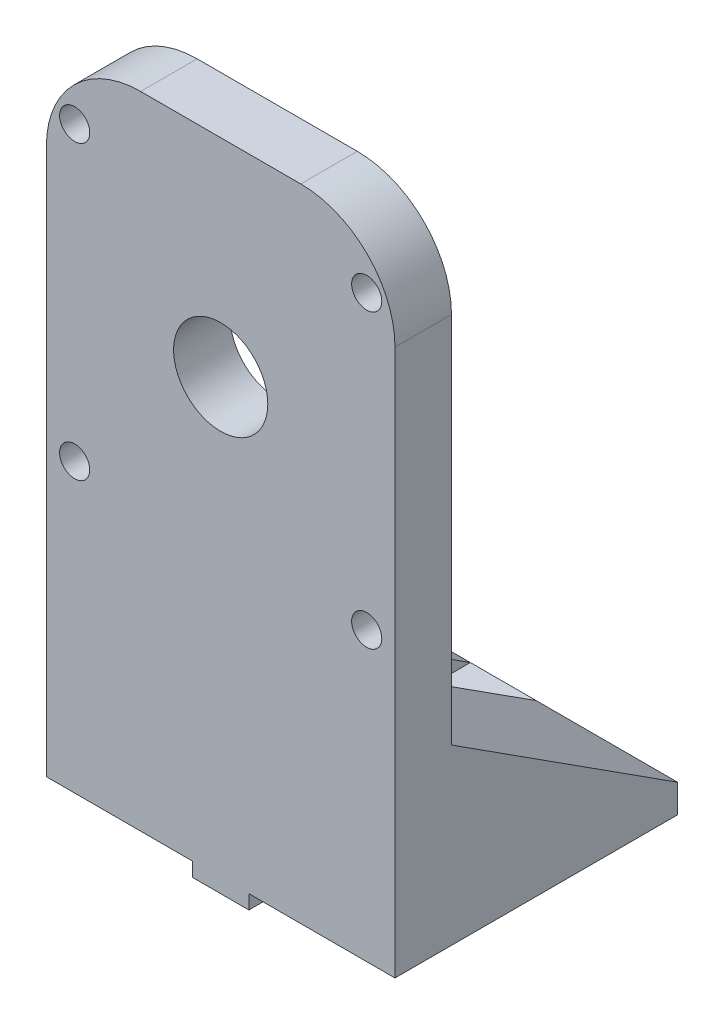
ISO-10303-21;
HEADER;
FILE_DESCRIPTION(('STEP AP214'),'2;1');
FILE_NAME('part.step','',(''),(''),'','','');
FILE_SCHEMA(('AUTOMOTIVE_DESIGN { 1 0 10303 214 1 1 1 1 }'));
ENDSEC;
DATA;
#1=APPLICATION_CONTEXT('core data for automotive mechanical design processes');
#2=APPLICATION_PROTOCOL_DEFINITION('international standard','automotive_design',2000,#1);
#3=PRODUCT_CONTEXT('',#1,'mechanical');
#4=PRODUCT('Part','Part','',(#3));
#5=PRODUCT_RELATED_PRODUCT_CATEGORY('part','',(#4));
#6=PRODUCT_DEFINITION_FORMATION('','',#4);
#7=PRODUCT_DEFINITION_CONTEXT('part definition',#1,'design');
#8=PRODUCT_DEFINITION('design','',#6,#7);
#9=PRODUCT_DEFINITION_SHAPE('','',#8);
#10=(LENGTH_UNIT() NAMED_UNIT(*) SI_UNIT(.MILLI.,.METRE.));
#11=(NAMED_UNIT(*) PLANE_ANGLE_UNIT() SI_UNIT($,.RADIAN.));
#12=(NAMED_UNIT(*) SI_UNIT($,.STERADIAN.) SOLID_ANGLE_UNIT());
#13=UNCERTAINTY_MEASURE_WITH_UNIT(LENGTH_MEASURE(1.E-05),#10,'distance_accuracy_value','');
#14=(GEOMETRIC_REPRESENTATION_CONTEXT(3) GLOBAL_UNCERTAINTY_ASSIGNED_CONTEXT((#13)) GLOBAL_UNIT_ASSIGNED_CONTEXT((#10,
#11,#12)) REPRESENTATION_CONTEXT('',''));
#15=CARTESIAN_POINT('',(0.,0.,0.));
#16=DIRECTION('',(0.,0.,1.));
#17=DIRECTION('',(1.,0.,0.));
#18=AXIS2_PLACEMENT_3D('',#15,#16,#17);
#19=CARTESIAN_POINT('',(37.,0.,-24.));
#20=DIRECTION('',(0.,1.,0.));
#21=DIRECTION('',(-1.,0.,0.));
#22=AXIS2_PLACEMENT_3D('',#19,#20,#21);
#23=PLANE('',#22);
#24=DIRECTION('',(0.,0.,-1.));
#25=VECTOR('',#24,1.);
#26=CARTESIAN_POINT('',(22.,0.,0.));
#27=LINE('',#26,#25);
#28=CARTESIAN_POINT('',(22.,0.,0.));
#29=VERTEX_POINT('',#28);
#30=CARTESIAN_POINT('',(22.,0.,-24.));
#31=VERTEX_POINT('',#30);
#32=EDGE_CURVE('E157',#29,#31,#27,.T.);
#33=ORIENTED_EDGE('',*,*,#32,.T.);
#34=DIRECTION('',(-1.,0.,0.));
#35=VECTOR('',#34,1.);
#36=CARTESIAN_POINT('',(37.,0.,-24.));
#37=LINE('',#36,#35);
#38=CARTESIAN_POINT('',(15.,0.,-24.));
#39=VERTEX_POINT('',#38);
#40=EDGE_CURVE('E143',#31,#39,#37,.T.);
#41=ORIENTED_EDGE('',*,*,#40,.T.);
#42=DIRECTION('',(0.,0.,1.));
#43=VECTOR('',#42,1.);
#44=CARTESIAN_POINT('',(15.,0.,-24.));
#45=LINE('',#44,#43);
#46=CARTESIAN_POINT('',(15.,0.,0.));
#47=VERTEX_POINT('',#46);
#48=EDGE_CURVE('E193',#39,#47,#45,.T.);
#49=ORIENTED_EDGE('',*,*,#48,.T.);
#50=DIRECTION('',(1.,0.,0.));
#51=VECTOR('',#50,1.);
#52=CARTESIAN_POINT('',(0.,0.,0.));
#53=LINE('',#52,#51);
#54=EDGE_CURVE('E159',#47,#29,#53,.T.);
#55=ORIENTED_EDGE('',*,*,#54,.T.);
#56=EDGE_LOOP('',(#33,#41,#49,#55));
#57=FACE_BOUND('',#56,.T.);
#58=CARTESIAN_POINT('',(18.5,0.,-18.));
#59=DIRECTION('',(0.,1.,0.));
#60=DIRECTION('',(-1.,0.,0.));
#61=AXIS2_PLACEMENT_3D('',#58,#59,#60);
#62=CIRCLE('',#61,1.75);
#63=CARTESIAN_POINT('',(16.75,0.,-18.));
#64=VERTEX_POINT('',#63);
#65=EDGE_CURVE('E186',#64,#64,#62,.T.);
#66=ORIENTED_EDGE('',*,*,#65,.F.);
#67=EDGE_LOOP('',(#66));
#68=FACE_BOUND('',#67,.T.);
#69=CARTESIAN_POINT('',(18.4258048726623,0.,-4.));
#70=DIRECTION('',(0.,1.,0.));
#71=DIRECTION('',(-1.,0.,0.));
#72=AXIS2_PLACEMENT_3D('',#69,#70,#71);
#73=CIRCLE('',#72,1.75);
#74=CARTESIAN_POINT('',(16.6758048726623,0.,-4.));
#75=VERTEX_POINT('',#74);
#76=EDGE_CURVE('E181',#75,#75,#73,.T.);
#77=ORIENTED_EDGE('',*,*,#76,.F.);
#78=EDGE_LOOP('',(#77));
#79=FACE_BOUND('',#78,.T.);
#80=ADVANCED_FACE('F37',(#57,#68,#79),#23,.T.);
#81=CARTESIAN_POINT('',(0.,0.,6.));
#82=DIRECTION('',(0.,0.,1.));
#83=DIRECTION('',(1.,0.,0.));
#84=AXIS2_PLACEMENT_3D('',#81,#82,#83);
#85=PLANE('',#84);
#86=CARTESIAN_POINT('',(34.,27.5,6.));
#87=DIRECTION('',(0.,0.,-1.));
#88=DIRECTION('',(-1.,0.,0.));
#89=AXIS2_PLACEMENT_3D('',#86,#87,#88);
#90=CIRCLE('',#89,1.6);
#91=CARTESIAN_POINT('',(32.4,27.5,6.));
#92=VERTEX_POINT('',#91);
#93=EDGE_CURVE('E203',#92,#92,#90,.T.);
#94=ORIENTED_EDGE('',*,*,#93,.T.);
#95=EDGE_LOOP('',(#94));
#96=FACE_BOUND('',#95,.T.);
#97=CARTESIAN_POINT('',(3.,27.5,6.));
#98=DIRECTION('',(0.,0.,1.));
#99=DIRECTION('',(1.,0.,0.));
#100=AXIS2_PLACEMENT_3D('',#97,#98,#99);
#101=CIRCLE('',#100,1.6);
#102=CARTESIAN_POINT('',(4.6,27.5,6.));
#103=VERTEX_POINT('',#102);
#104=EDGE_CURVE('E206',#103,#103,#101,.T.);
#105=ORIENTED_EDGE('',*,*,#104,.F.);
#106=EDGE_LOOP('',(#105));
#107=FACE_BOUND('',#106,.T.);
#108=DIRECTION('',(-1.,0.,0.));
#109=VECTOR('',#108,1.);
#110=CARTESIAN_POINT('',(21.,65.,6.));
#111=LINE('',#110,#109);
#112=CARTESIAN_POINT('',(27.,65.,6.));
#113=VERTEX_POINT('',#112);
#114=CARTESIAN_POINT('',(10.,65.,6.));
#115=VERTEX_POINT('',#114);
#116=EDGE_CURVE('E267',#113,#115,#111,.T.);
#117=ORIENTED_EDGE('',*,*,#116,.T.);
#118=CARTESIAN_POINT('',(10.,55.,6.));
#119=DIRECTION('',(0.,0.,1.));
#120=DIRECTION('',(1.,0.,0.));
#121=AXIS2_PLACEMENT_3D('',#118,#119,#120);
#122=CIRCLE('',#121,10.);
#123=CARTESIAN_POINT('',(0.,55.,6.));
#124=VERTEX_POINT('',#123);
#125=EDGE_CURVE('E46',#115,#124,#122,.T.);
#126=ORIENTED_EDGE('',*,*,#125,.T.);
#127=DIRECTION('',(0.,-1.,0.));
#128=VECTOR('',#127,1.);
#129=CARTESIAN_POINT('',(0.,0.,6.));
#130=LINE('',#129,#128);
#131=CARTESIAN_POINT('',(0.,-3.,6.));
#132=VERTEX_POINT('',#131);
#133=EDGE_CURVE('E271',#124,#132,#130,.T.);
#134=ORIENTED_EDGE('',*,*,#133,.T.);
#135=DIRECTION('',(1.,0.,0.));
#136=VECTOR('',#135,1.);
#137=CARTESIAN_POINT('',(37.,-3.,6.));
#138=LINE('',#137,#136);
#139=CARTESIAN_POINT('',(15.5,-3.,6.));
#140=VERTEX_POINT('',#139);
#141=EDGE_CURVE('E242',#132,#140,#138,.T.);
#142=ORIENTED_EDGE('',*,*,#141,.T.);
#143=DIRECTION('',(0.,-1.,0.));
#144=VECTOR('',#143,1.);
#145=CARTESIAN_POINT('',(15.5,-3.00000000000001,6.));
#146=LINE('',#145,#144);
#147=CARTESIAN_POINT('',(15.5,-4.5,6.));
#148=VERTEX_POINT('',#147);
#149=EDGE_CURVE('E219',#140,#148,#146,.T.);
#150=ORIENTED_EDGE('',*,*,#149,.T.);
#151=DIRECTION('',(1.,0.,0.));
#152=VECTOR('',#151,1.);
#153=CARTESIAN_POINT('',(21.5,-4.5,6.));
#154=LINE('',#153,#152);
#155=CARTESIAN_POINT('',(21.5,-4.5,6.));
#156=VERTEX_POINT('',#155);
#157=EDGE_CURVE('E215',#148,#156,#154,.T.);
#158=ORIENTED_EDGE('',*,*,#157,.T.);
#159=DIRECTION('',(0.,1.,0.));
#160=VECTOR('',#159,1.);
#161=CARTESIAN_POINT('',(21.5,-3.,6.));
#162=LINE('',#161,#160);
#163=CARTESIAN_POINT('',(21.5,-3.,6.));
#164=VERTEX_POINT('',#163);
#165=EDGE_CURVE('E222',#156,#164,#162,.T.);
#166=ORIENTED_EDGE('',*,*,#165,.T.);
#167=CARTESIAN_POINT('',(37.,-3.,6.));
#168=VERTEX_POINT('',#167);
#169=EDGE_CURVE('E241',#164,#168,#138,.T.);
#170=ORIENTED_EDGE('',*,*,#169,.T.);
#171=DIRECTION('',(0.,1.,0.));
#172=VECTOR('',#171,1.);
#173=CARTESIAN_POINT('',(37.,0.,6.));
#174=LINE('',#173,#172);
#175=CARTESIAN_POINT('',(37.,55.,6.));
#176=VERTEX_POINT('',#175);
#177=EDGE_CURVE('E264',#168,#176,#174,.T.);
#178=ORIENTED_EDGE('',*,*,#177,.T.);
#179=CARTESIAN_POINT('',(27.,55.,6.));
#180=DIRECTION('',(0.,0.,1.));
#181=DIRECTION('',(1.,0.,0.));
#182=AXIS2_PLACEMENT_3D('',#179,#180,#181);
#183=CIRCLE('',#182,10.);
#184=EDGE_CURVE('E294',#176,#113,#183,.T.);
#185=ORIENTED_EDGE('',*,*,#184,.T.);
#186=EDGE_LOOP('',(#117,#126,#134,#142,#150,#158,#166,#170,#178,#185));
#187=FACE_BOUND('',#186,.T.);
#188=CARTESIAN_POINT('',(18.5,43.,6.));
#189=DIRECTION('',(0.,0.,1.));
#190=DIRECTION('',(1.,0.,0.));
#191=AXIS2_PLACEMENT_3D('',#188,#189,#190);
#192=CIRCLE('',#191,5.);
#193=CARTESIAN_POINT('',(23.5,43.,6.));
#194=VERTEX_POINT('',#193);
#195=EDGE_CURVE('E259',#194,#194,#192,.T.);
#196=ORIENTED_EDGE('',*,*,#195,.F.);
#197=EDGE_LOOP('',(#196));
#198=FACE_BOUND('',#197,.T.);
#199=CARTESIAN_POINT('',(34.,58.5,6.));
#200=DIRECTION('',(0.,0.,1.));
#201=DIRECTION('',(1.,0.,0.));
#202=AXIS2_PLACEMENT_3D('',#199,#200,#201);
#203=CIRCLE('',#202,1.60000000000001);
#204=CARTESIAN_POINT('',(35.6,58.5,6.));
#205=VERTEX_POINT('',#204);
#206=EDGE_CURVE('E207',#205,#205,#203,.T.);
#207=ORIENTED_EDGE('',*,*,#206,.F.);
#208=EDGE_LOOP('',(#207));
#209=FACE_BOUND('',#208,.T.);
#210=CARTESIAN_POINT('',(3.,58.5,6.));
#211=DIRECTION('',(0.,0.,-1.));
#212=DIRECTION('',(-1.,0.,0.));
#213=AXIS2_PLACEMENT_3D('',#210,#211,#212);
#214=CIRCLE('',#213,1.6);
#215=CARTESIAN_POINT('',(1.4,58.5,6.));
#216=VERTEX_POINT('',#215);
#217=EDGE_CURVE('E201',#216,#216,#214,.T.);
#218=ORIENTED_EDGE('',*,*,#217,.T.);
#219=EDGE_LOOP('',(#218));
#220=FACE_BOUND('',#219,.T.);
#221=ADVANCED_FACE('F313',(#96,#107,#187,#198,#209,#220),#85,.T.);
#222=CARTESIAN_POINT('',(0.,0.,0.));
#223=DIRECTION('',(0.,0.,1.));
#224=DIRECTION('',(1.,0.,0.));
#225=AXIS2_PLACEMENT_3D('',#222,#223,#224);
#226=PLANE('',#225);
#227=CARTESIAN_POINT('',(34.,58.5,0.));
#228=DIRECTION('',(0.,0.,1.));
#229=DIRECTION('',(1.,0.,0.));
#230=AXIS2_PLACEMENT_3D('',#227,#228,#229);
#231=CIRCLE('',#230,1.60000000000001);
#232=CARTESIAN_POINT('',(35.6,58.5,0.));
#233=VERTEX_POINT('',#232);
#234=EDGE_CURVE('E301',#233,#233,#231,.T.);
#235=ORIENTED_EDGE('',*,*,#234,.T.);
#236=EDGE_LOOP('',(#235));
#237=FACE_BOUND('',#236,.T.);
#238=CARTESIAN_POINT('',(3.,27.5,0.));
#239=DIRECTION('',(0.,0.,1.));
#240=DIRECTION('',(1.,0.,0.));
#241=AXIS2_PLACEMENT_3D('',#238,#239,#240);
#242=CIRCLE('',#241,1.6);
#243=CARTESIAN_POINT('',(4.6,27.5,0.));
#244=VERTEX_POINT('',#243);
#245=EDGE_CURVE('E214',#244,#244,#242,.T.);
#246=ORIENTED_EDGE('',*,*,#245,.T.);
#247=EDGE_LOOP('',(#246));
#248=FACE_BOUND('',#247,.T.);
#249=DIRECTION('',(0.,1.,0.));
#250=VECTOR('',#249,1.);
#251=CARTESIAN_POINT('',(37.,0.,0.));
#252=LINE('',#251,#250);
#253=CARTESIAN_POINT('',(37.,15.4161670107412,0.));
#254=VERTEX_POINT('',#253);
#255=CARTESIAN_POINT('',(37.,55.,0.));
#256=VERTEX_POINT('',#255);
#257=EDGE_CURVE('E275',#254,#256,#252,.T.);
#258=ORIENTED_EDGE('',*,*,#257,.F.);
#259=DIRECTION('',(1.,0.,0.));
#260=VECTOR('',#259,1.);
#261=CARTESIAN_POINT('',(22.,15.4161670107412,0.));
#262=LINE('',#261,#260);
#263=CARTESIAN_POINT('',(22.,15.4161670107412,0.));
#264=VERTEX_POINT('',#263);
#265=EDGE_CURVE('E54',#264,#254,#262,.T.);
#266=ORIENTED_EDGE('',*,*,#265,.F.);
#267=DIRECTION('',(0.,-1.,0.));
#268=VECTOR('',#267,1.);
#269=CARTESIAN_POINT('',(22.,0.,0.));
#270=LINE('',#269,#268);
#271=EDGE_CURVE('E58',#264,#29,#270,.T.);
#272=ORIENTED_EDGE('',*,*,#271,.T.);
#273=ORIENTED_EDGE('',*,*,#54,.F.);
#274=DIRECTION('',(0.,1.,0.));
#275=VECTOR('',#274,1.);
#276=CARTESIAN_POINT('',(15.,0.,0.));
#277=LINE('',#276,#275);
#278=CARTESIAN_POINT('',(15.,15.4161670107412,0.));
#279=VERTEX_POINT('',#278);
#280=EDGE_CURVE('E195',#47,#279,#277,.T.);
#281=ORIENTED_EDGE('',*,*,#280,.T.);
#282=DIRECTION('',(-1.,0.,0.));
#283=VECTOR('',#282,1.);
#284=CARTESIAN_POINT('',(15.,15.4161670107412,0.));
#285=LINE('',#284,#283);
#286=CARTESIAN_POINT('',(0.,15.4161670107412,0.));
#287=VERTEX_POINT('',#286);
#288=EDGE_CURVE('E199',#279,#287,#285,.T.);
#289=ORIENTED_EDGE('',*,*,#288,.T.);
#290=DIRECTION('',(0.,-1.,0.));
#291=VECTOR('',#290,1.);
#292=CARTESIAN_POINT('',(0.,0.,0.));
#293=LINE('',#292,#291);
#294=CARTESIAN_POINT('',(0.,55.,0.));
#295=VERTEX_POINT('',#294);
#296=EDGE_CURVE('E268',#295,#287,#293,.T.);
#297=ORIENTED_EDGE('',*,*,#296,.F.);
#298=CARTESIAN_POINT('',(10.,55.,0.));
#299=DIRECTION('',(0.,0.,1.));
#300=DIRECTION('',(1.,0.,0.));
#301=AXIS2_PLACEMENT_3D('',#298,#299,#300);
#302=CIRCLE('',#301,10.);
#303=CARTESIAN_POINT('',(10.,65.,0.));
#304=VERTEX_POINT('',#303);
#305=EDGE_CURVE('E287',#295,#304,#302,.F.);
#306=ORIENTED_EDGE('',*,*,#305,.T.);
#307=DIRECTION('',(-1.,0.,0.));
#308=VECTOR('',#307,1.);
#309=CARTESIAN_POINT('',(0.,65.,0.));
#310=LINE('',#309,#308);
#311=CARTESIAN_POINT('',(27.,65.,0.));
#312=VERTEX_POINT('',#311);
#313=EDGE_CURVE('E277',#312,#304,#310,.T.);
#314=ORIENTED_EDGE('',*,*,#313,.F.);
#315=CARTESIAN_POINT('',(27.,55.,0.));
#316=DIRECTION('',(0.,0.,1.));
#317=DIRECTION('',(1.,0.,0.));
#318=AXIS2_PLACEMENT_3D('',#315,#316,#317);
#319=CIRCLE('',#318,10.);
#320=EDGE_CURVE('E284',#312,#256,#319,.F.);
#321=ORIENTED_EDGE('',*,*,#320,.T.);
#322=EDGE_LOOP('',(#258,#266,#272,#273,#281,#289,#297,#306,#314,#321));
#323=FACE_BOUND('',#322,.T.);
#324=CARTESIAN_POINT('',(18.5,43.,0.));
#325=DIRECTION('',(0.,0.,1.));
#326=DIRECTION('',(1.,0.,0.));
#327=AXIS2_PLACEMENT_3D('',#324,#325,#326);
#328=CIRCLE('',#327,5.);
#329=CARTESIAN_POINT('',(23.5,43.,0.));
#330=VERTEX_POINT('',#329);
#331=EDGE_CURVE('E256',#330,#330,#328,.T.);
#332=ORIENTED_EDGE('',*,*,#331,.T.);
#333=EDGE_LOOP('',(#332));
#334=FACE_BOUND('',#333,.T.);
#335=CARTESIAN_POINT('',(34.,27.5,0.));
#336=DIRECTION('',(0.,0.,1.));
#337=DIRECTION('',(1.,0.,0.));
#338=AXIS2_PLACEMENT_3D('',#335,#336,#337);
#339=CIRCLE('',#338,1.6);
#340=CARTESIAN_POINT('',(35.6,27.5,0.));
#341=VERTEX_POINT('',#340);
#342=EDGE_CURVE('E299',#341,#341,#339,.F.);
#343=ORIENTED_EDGE('',*,*,#342,.F.);
#344=EDGE_LOOP('',(#343));
#345=FACE_BOUND('',#344,.T.);
#346=CARTESIAN_POINT('',(3.,58.5,0.));
#347=DIRECTION('',(0.,0.,1.));
#348=DIRECTION('',(1.,0.,0.));
#349=AXIS2_PLACEMENT_3D('',#346,#347,#348);
#350=CIRCLE('',#349,1.6);
#351=CARTESIAN_POINT('',(4.6,58.5,0.));
#352=VERTEX_POINT('',#351);
#353=EDGE_CURVE('E41',#352,#352,#350,.F.);
#354=ORIENTED_EDGE('',*,*,#353,.F.);
#355=EDGE_LOOP('',(#354));
#356=FACE_BOUND('',#355,.T.);
#357=ADVANCED_FACE('F310',(#237,#248,#323,#334,#345,#356),#226,.F.);
#358=CARTESIAN_POINT('',(37.,-3.,-24.));
#359=DIRECTION('',(0.,-1.,0.));
#360=DIRECTION('',(1.,0.,0.));
#361=AXIS2_PLACEMENT_3D('',#358,#359,#360);
#362=PLANE('',#361);
#363=DIRECTION('',(1.,0.,0.));
#364=VECTOR('',#363,1.);
#365=CARTESIAN_POINT('',(37.,-3.,-24.));
#366=LINE('',#365,#364);
#367=CARTESIAN_POINT('',(0.,-3.,-24.));
#368=VERTEX_POINT('',#367);
#369=CARTESIAN_POINT('',(15.5,-3.00000000000001,-24.));
#370=VERTEX_POINT('',#369);
#371=EDGE_CURVE('E247',#368,#370,#366,.T.);
#372=ORIENTED_EDGE('',*,*,#371,.T.);
#373=DIRECTION('',(0.,0.,1.));
#374=VECTOR('',#373,1.);
#375=CARTESIAN_POINT('',(15.5,-3.00000000000001,-30.1846584384265));
#376=LINE('',#375,#374);
#377=EDGE_CURVE('E218',#370,#140,#376,.T.);
#378=ORIENTED_EDGE('',*,*,#377,.T.);
#379=ORIENTED_EDGE('',*,*,#141,.F.);
#380=DIRECTION('',(0.,0.,1.));
#381=VECTOR('',#380,1.);
#382=CARTESIAN_POINT('',(0.,-3.,-24.));
#383=LINE('',#382,#381);
#384=EDGE_CURVE('E250',#368,#132,#383,.T.);
#385=ORIENTED_EDGE('',*,*,#384,.F.);
#386=EDGE_LOOP('',(#372,#378,#379,#385));
#387=FACE_BOUND('',#386,.T.);
#388=ADVANCED_FACE('F312',(#387),#362,.T.);
#389=CARTESIAN_POINT('',(37.,0.,6.));
#390=DIRECTION('',(-1.,0.,0.));
#391=DIRECTION('',(0.,0.,1.));
#392=AXIS2_PLACEMENT_3D('',#389,#390,#391);
#393=PLANE('',#392);
#394=DIRECTION('',(0.,0.540449852166708,0.841376228148254));
#395=VECTOR('',#394,1.);
#396=CARTESIAN_POINT('',(37.,15.4161670107412,0.));
#397=LINE('',#396,#395);
#398=CARTESIAN_POINT('',(37.,0.,-24.));
#399=VERTEX_POINT('',#398);
#400=EDGE_CURVE('E169',#399,#254,#397,.T.);
#401=ORIENTED_EDGE('',*,*,#400,.T.);
#402=ORIENTED_EDGE('',*,*,#257,.T.);
#403=DIRECTION('',(0.,0.,-1.));
#404=VECTOR('',#403,1.);
#405=CARTESIAN_POINT('',(37.,55.,6.));
#406=LINE('',#405,#404);
#407=EDGE_CURVE('E11',#256,#176,#406,.F.);
#408=ORIENTED_EDGE('',*,*,#407,.T.);
#409=ORIENTED_EDGE('',*,*,#177,.F.);
#410=DIRECTION('',(0.,0.,1.));
#411=VECTOR('',#410,1.);
#412=CARTESIAN_POINT('',(37.,-3.,-24.));
#413=LINE('',#412,#411);
#414=CARTESIAN_POINT('',(37.,-3.,-24.));
#415=VERTEX_POINT('',#414);
#416=EDGE_CURVE('E253',#415,#168,#413,.T.);
#417=ORIENTED_EDGE('',*,*,#416,.F.);
#418=DIRECTION('',(0.,1.,0.));
#419=VECTOR('',#418,1.);
#420=CARTESIAN_POINT('',(37.,0.,-24.));
#421=LINE('',#420,#419);
#422=EDGE_CURVE('E154',#415,#399,#421,.T.);
#423=ORIENTED_EDGE('',*,*,#422,.T.);
#424=EDGE_LOOP('',(#401,#402,#408,#409,#417,#423));
#425=FACE_BOUND('',#424,.T.);
#426=ADVANCED_FACE('F319',(#425),#393,.F.);
#427=CARTESIAN_POINT('',(0.,65.,6.));
#428=DIRECTION('',(0.,-1.,0.));
#429=DIRECTION('',(0.,0.,-1.));
#430=AXIS2_PLACEMENT_3D('',#427,#428,#429);
#431=PLANE('',#430);
#432=ORIENTED_EDGE('',*,*,#313,.T.);
#433=DIRECTION('',(0.,0.,-1.));
#434=VECTOR('',#433,1.);
#435=CARTESIAN_POINT('',(10.,65.,6.));
#436=LINE('',#435,#434);
#437=EDGE_CURVE('E292',#304,#115,#436,.F.);
#438=ORIENTED_EDGE('',*,*,#437,.T.);
#439=ORIENTED_EDGE('',*,*,#116,.F.);
#440=DIRECTION('',(0.,0.,-1.));
#441=VECTOR('',#440,1.);
#442=CARTESIAN_POINT('',(27.,65.,6.));
#443=LINE('',#442,#441);
#444=EDGE_CURVE('E289',#113,#312,#443,.T.);
#445=ORIENTED_EDGE('',*,*,#444,.T.);
#446=EDGE_LOOP('',(#432,#438,#439,#445));
#447=FACE_BOUND('',#446,.T.);
#448=ADVANCED_FACE('F343',(#447),#431,.F.);
#449=CARTESIAN_POINT('',(0.,0.,6.));
#450=DIRECTION('',(1.,0.,0.));
#451=DIRECTION('',(0.,0.,-1.));
#452=AXIS2_PLACEMENT_3D('',#449,#450,#451);
#453=PLANE('',#452);
#454=ORIENTED_EDGE('',*,*,#296,.T.);
#455=DIRECTION('',(0.,-0.540449852166708,-0.841376228148254));
#456=VECTOR('',#455,1.);
#457=CARTESIAN_POINT('',(0.,0.,-24.));
#458=LINE('',#457,#456);
#459=CARTESIAN_POINT('',(0.,0.,-24.));
#460=VERTEX_POINT('',#459);
#461=EDGE_CURVE('E189',#287,#460,#458,.T.);
#462=ORIENTED_EDGE('',*,*,#461,.T.);
#463=DIRECTION('',(0.,-1.,0.));
#464=VECTOR('',#463,1.);
#465=CARTESIAN_POINT('',(0.,0.,-24.));
#466=LINE('',#465,#464);
#467=EDGE_CURVE('E170',#460,#368,#466,.T.);
#468=ORIENTED_EDGE('',*,*,#467,.T.);
#469=ORIENTED_EDGE('',*,*,#384,.T.);
#470=ORIENTED_EDGE('',*,*,#133,.F.);
#471=DIRECTION('',(0.,0.,-1.));
#472=VECTOR('',#471,1.);
#473=CARTESIAN_POINT('',(0.,55.,6.));
#474=LINE('',#473,#472);
#475=EDGE_CURVE('E273',#124,#295,#474,.T.);
#476=ORIENTED_EDGE('',*,*,#475,.T.);
#477=EDGE_LOOP('',(#454,#462,#468,#469,#470,#476));
#478=FACE_BOUND('',#477,.T.);
#479=ADVANCED_FACE('F336',(#478),#453,.F.);
#480=CARTESIAN_POINT('',(18.5,43.,6.));
#481=DIRECTION('',(0.,0.,-1.));
#482=DIRECTION('',(-1.,0.,0.));
#483=AXIS2_PLACEMENT_3D('',#480,#481,#482);
#484=CYLINDRICAL_SURFACE('',#483,5.);
#485=ORIENTED_EDGE('',*,*,#195,.T.);
#486=EDGE_LOOP('',(#485));
#487=FACE_BOUND('',#486,.T.);
#488=ORIENTED_EDGE('',*,*,#331,.F.);
#489=EDGE_LOOP('',(#488));
#490=FACE_BOUND('',#489,.T.);
#491=ADVANCED_FACE('F333',(#487,#490),#484,.F.);
#492=CARTESIAN_POINT('',(10.,55.,6.));
#493=DIRECTION('',(0.,0.,-1.));
#494=DIRECTION('',(-1.,0.,0.));
#495=AXIS2_PLACEMENT_3D('',#492,#493,#494);
#496=CYLINDRICAL_SURFACE('',#495,10.);
#497=ORIENTED_EDGE('',*,*,#125,.F.);
#498=ORIENTED_EDGE('',*,*,#437,.F.);
#499=ORIENTED_EDGE('',*,*,#305,.F.);
#500=ORIENTED_EDGE('',*,*,#475,.F.);
#501=EDGE_LOOP('',(#497,#498,#499,#500));
#502=FACE_BOUND('',#501,.T.);
#503=ADVANCED_FACE('F335',(#502),#496,.T.);
#504=CARTESIAN_POINT('',(27.,55.,6.));
#505=DIRECTION('',(0.,0.,-1.));
#506=DIRECTION('',(-1.,0.,0.));
#507=AXIS2_PLACEMENT_3D('',#504,#505,#506);
#508=CYLINDRICAL_SURFACE('',#507,10.);
#509=ORIENTED_EDGE('',*,*,#184,.F.);
#510=ORIENTED_EDGE('',*,*,#407,.F.);
#511=ORIENTED_EDGE('',*,*,#320,.F.);
#512=ORIENTED_EDGE('',*,*,#444,.F.);
#513=EDGE_LOOP('',(#509,#510,#511,#512));
#514=FACE_BOUND('',#513,.T.);
#515=ADVANCED_FACE('F39',(#514),#508,.T.);
#516=DIRECTION('',(0.,0.,1.));
#517=VECTOR('',#516,1.);
#518=CARTESIAN_POINT('',(21.5,-3.,-30.1846584384265));
#519=LINE('',#518,#517);
#520=CARTESIAN_POINT('',(21.5,-3.,-24.));
#521=VERTEX_POINT('',#520);
#522=EDGE_CURVE('E227',#521,#164,#519,.T.);
#523=ORIENTED_EDGE('',*,*,#522,.F.);
#524=EDGE_CURVE('E246',#521,#415,#366,.T.);
#525=ORIENTED_EDGE('',*,*,#524,.T.);
#526=ORIENTED_EDGE('',*,*,#416,.T.);
#527=ORIENTED_EDGE('',*,*,#169,.F.);
#528=EDGE_LOOP('',(#523,#525,#526,#527));
#529=FACE_BOUND('',#528,.T.);
#530=ADVANCED_FACE('F322',(#529),#362,.T.);
#531=CARTESIAN_POINT('',(0.,0.,-24.));
#532=DIRECTION('',(0.,0.,-1.));
#533=DIRECTION('',(-1.,0.,0.));
#534=AXIS2_PLACEMENT_3D('',#531,#532,#533);
#535=PLANE('',#534);
#536=ORIENTED_EDGE('',*,*,#422,.F.);
#537=ORIENTED_EDGE('',*,*,#524,.F.);
#538=DIRECTION('',(0.,1.,0.));
#539=VECTOR('',#538,1.);
#540=CARTESIAN_POINT('',(21.5,-3.,-24.));
#541=LINE('',#540,#539);
#542=CARTESIAN_POINT('',(21.5,-4.5,-24.));
#543=VERTEX_POINT('',#542);
#544=EDGE_CURVE('E225',#543,#521,#541,.T.);
#545=ORIENTED_EDGE('',*,*,#544,.F.);
#546=DIRECTION('',(1.,0.,0.));
#547=VECTOR('',#546,1.);
#548=CARTESIAN_POINT('',(21.5,-4.5,-24.));
#549=LINE('',#548,#547);
#550=CARTESIAN_POINT('',(15.5,-4.5,-24.));
#551=VERTEX_POINT('',#550);
#552=EDGE_CURVE('E229',#551,#543,#549,.T.);
#553=ORIENTED_EDGE('',*,*,#552,.F.);
#554=DIRECTION('',(0.,-1.,0.));
#555=VECTOR('',#554,1.);
#556=CARTESIAN_POINT('',(15.5,-3.00000000000001,-24.));
#557=LINE('',#556,#555);
#558=EDGE_CURVE('E233',#370,#551,#557,.T.);
#559=ORIENTED_EDGE('',*,*,#558,.F.);
#560=ORIENTED_EDGE('',*,*,#371,.F.);
#561=ORIENTED_EDGE('',*,*,#467,.F.);
#562=DIRECTION('',(-1.,0.,0.));
#563=VECTOR('',#562,1.);
#564=CARTESIAN_POINT('',(15.,0.,-24.));
#565=LINE('',#564,#563);
#566=EDGE_CURVE('E151',#39,#460,#565,.T.);
#567=ORIENTED_EDGE('',*,*,#566,.F.);
#568=ORIENTED_EDGE('',*,*,#40,.F.);
#569=EDGE_CURVE('E148',#399,#31,#37,.T.);
#570=ORIENTED_EDGE('',*,*,#569,.F.);
#571=EDGE_LOOP('',(#536,#537,#545,#553,#559,#560,#561,#567,#568,#570));
#572=FACE_BOUND('',#571,.T.);
#573=ADVANCED_FACE('F146',(#572),#535,.T.);
#574=CARTESIAN_POINT('',(15.5,-3.00000000000001,-30.1846584384265));
#575=DIRECTION('',(-1.,0.,0.));
#576=DIRECTION('',(0.,-1.,0.));
#577=AXIS2_PLACEMENT_3D('',#574,#575,#576);
#578=PLANE('',#577);
#579=ORIENTED_EDGE('',*,*,#377,.F.);
#580=ORIENTED_EDGE('',*,*,#558,.T.);
#581=DIRECTION('',(0.,0.,1.));
#582=VECTOR('',#581,1.);
#583=CARTESIAN_POINT('',(15.5,-4.5,-30.1846584384265));
#584=LINE('',#583,#582);
#585=EDGE_CURVE('E232',#551,#148,#584,.T.);
#586=ORIENTED_EDGE('',*,*,#585,.T.);
#587=ORIENTED_EDGE('',*,*,#149,.F.);
#588=EDGE_LOOP('',(#579,#580,#586,#587));
#589=FACE_BOUND('',#588,.T.);
#590=ADVANCED_FACE('F381',(#589),#578,.T.);
#591=CARTESIAN_POINT('',(21.5,-4.5,-30.1846584384265));
#592=DIRECTION('',(0.,-1.,0.));
#593=DIRECTION('',(1.,0.,0.));
#594=AXIS2_PLACEMENT_3D('',#591,#592,#593);
#595=PLANE('',#594);
#596=CARTESIAN_POINT('',(18.5,-4.5,-18.));
#597=DIRECTION('',(0.,-1.,0.));
#598=DIRECTION('',(1.,0.,0.));
#599=AXIS2_PLACEMENT_3D('',#596,#597,#598);
#600=CIRCLE('',#599,1.75);
#601=CARTESIAN_POINT('',(20.25,-4.5,-18.));
#602=VERTEX_POINT('',#601);
#603=EDGE_CURVE('E178',#602,#602,#600,.T.);
#604=ORIENTED_EDGE('',*,*,#603,.F.);
#605=EDGE_LOOP('',(#604));
#606=FACE_BOUND('',#605,.T.);
#607=CARTESIAN_POINT('',(18.4258048726623,-4.5,-4.));
#608=DIRECTION('',(0.,-1.,0.));
#609=DIRECTION('',(1.,0.,0.));
#610=AXIS2_PLACEMENT_3D('',#607,#608,#609);
#611=CIRCLE('',#610,1.75);
#612=CARTESIAN_POINT('',(20.1758048726623,-4.5,-4.));
#613=VERTEX_POINT('',#612);
#614=EDGE_CURVE('E173',#613,#613,#611,.T.);
#615=ORIENTED_EDGE('',*,*,#614,.F.);
#616=EDGE_LOOP('',(#615));
#617=FACE_BOUND('',#616,.T.);
#618=ORIENTED_EDGE('',*,*,#585,.F.);
#619=ORIENTED_EDGE('',*,*,#552,.T.);
#620=DIRECTION('',(0.,0.,1.));
#621=VECTOR('',#620,1.);
#622=CARTESIAN_POINT('',(21.5,-4.5,-30.1846584384265));
#623=LINE('',#622,#621);
#624=EDGE_CURVE('E228',#543,#156,#623,.T.);
#625=ORIENTED_EDGE('',*,*,#624,.T.);
#626=ORIENTED_EDGE('',*,*,#157,.F.);
#627=EDGE_LOOP('',(#618,#619,#625,#626));
#628=FACE_BOUND('',#627,.T.);
#629=ADVANCED_FACE('F377',(#606,#617,#628),#595,.T.);
#630=CARTESIAN_POINT('',(21.5,-3.,-30.1846584384265));
#631=DIRECTION('',(1.,0.,0.));
#632=DIRECTION('',(0.,0.,-1.));
#633=AXIS2_PLACEMENT_3D('',#630,#631,#632);
#634=PLANE('',#633);
#635=ORIENTED_EDGE('',*,*,#624,.F.);
#636=ORIENTED_EDGE('',*,*,#544,.T.);
#637=ORIENTED_EDGE('',*,*,#522,.T.);
#638=ORIENTED_EDGE('',*,*,#165,.F.);
#639=EDGE_LOOP('',(#635,#636,#637,#638));
#640=FACE_BOUND('',#639,.T.);
#641=ADVANCED_FACE('F364',(#640),#634,.T.);
#642=CARTESIAN_POINT('',(3.,27.5,-4.));
#643=DIRECTION('',(0.,0.,1.));
#644=DIRECTION('',(1.,0.,0.));
#645=AXIS2_PLACEMENT_3D('',#642,#643,#644);
#646=CYLINDRICAL_SURFACE('',#645,1.6);
#647=ORIENTED_EDGE('',*,*,#104,.T.);
#648=EDGE_LOOP('',(#647));
#649=FACE_BOUND('',#648,.T.);
#650=ORIENTED_EDGE('',*,*,#245,.F.);
#651=EDGE_LOOP('',(#650));
#652=FACE_BOUND('',#651,.T.);
#653=ADVANCED_FACE('F355',(#649,#652),#646,.F.);
#654=CARTESIAN_POINT('',(34.,27.5,-4.));
#655=DIRECTION('',(0.,0.,1.));
#656=DIRECTION('',(1.,0.,0.));
#657=AXIS2_PLACEMENT_3D('',#654,#655,#656);
#658=CYLINDRICAL_SURFACE('',#657,1.6);
#659=ORIENTED_EDGE('',*,*,#93,.F.);
#660=EDGE_LOOP('',(#659));
#661=FACE_BOUND('',#660,.T.);
#662=ORIENTED_EDGE('',*,*,#342,.T.);
#663=EDGE_LOOP('',(#662));
#664=FACE_BOUND('',#663,.T.);
#665=ADVANCED_FACE('F352',(#661,#664),#658,.F.);
#666=CARTESIAN_POINT('',(34.,58.5,-4.));
#667=DIRECTION('',(0.,0.,1.));
#668=DIRECTION('',(1.,0.,0.));
#669=AXIS2_PLACEMENT_3D('',#666,#667,#668);
#670=CYLINDRICAL_SURFACE('',#669,1.60000000000001);
#671=ORIENTED_EDGE('',*,*,#206,.T.);
#672=EDGE_LOOP('',(#671));
#673=FACE_BOUND('',#672,.T.);
#674=ORIENTED_EDGE('',*,*,#234,.F.);
#675=EDGE_LOOP('',(#674));
#676=FACE_BOUND('',#675,.T.);
#677=ADVANCED_FACE('F354',(#673,#676),#670,.F.);
#678=CARTESIAN_POINT('',(3.,58.5,-4.));
#679=DIRECTION('',(0.,0.,1.));
#680=DIRECTION('',(1.,0.,0.));
#681=AXIS2_PLACEMENT_3D('',#678,#679,#680);
#682=CYLINDRICAL_SURFACE('',#681,1.6);
#683=ORIENTED_EDGE('',*,*,#217,.F.);
#684=EDGE_LOOP('',(#683));
#685=FACE_BOUND('',#684,.T.);
#686=ORIENTED_EDGE('',*,*,#353,.T.);
#687=EDGE_LOOP('',(#686));
#688=FACE_BOUND('',#687,.T.);
#689=ADVANCED_FACE('F308',(#685,#688),#682,.F.);
#690=CARTESIAN_POINT('',(15.,0.,-24.));
#691=DIRECTION('',(0.,0.841376228148254,-0.540449852166708));
#692=DIRECTION('',(0.,0.540449852166708,0.841376228148254));
#693=AXIS2_PLACEMENT_3D('',#690,#691,#692);
#694=PLANE('',#693);
#695=ORIENTED_EDGE('',*,*,#461,.F.);
#696=ORIENTED_EDGE('',*,*,#288,.F.);
#697=DIRECTION('',(0.,-0.540449852166708,-0.841376228148254));
#698=VECTOR('',#697,1.);
#699=CARTESIAN_POINT('',(15.,0.,-24.));
#700=LINE('',#699,#698);
#701=EDGE_CURVE('E190',#279,#39,#700,.T.);
#702=ORIENTED_EDGE('',*,*,#701,.T.);
#703=ORIENTED_EDGE('',*,*,#566,.T.);
#704=EDGE_LOOP('',(#695,#696,#702,#703));
#705=FACE_BOUND('',#704,.T.);
#706=ADVANCED_FACE('F369',(#705),#694,.T.);
#707=CARTESIAN_POINT('',(15.,0.,0.));
#708=DIRECTION('',(-1.,0.,0.));
#709=DIRECTION('',(0.,0.,1.));
#710=AXIS2_PLACEMENT_3D('',#707,#708,#709);
#711=PLANE('',#710);
#712=ORIENTED_EDGE('',*,*,#701,.F.);
#713=ORIENTED_EDGE('',*,*,#280,.F.);
#714=ORIENTED_EDGE('',*,*,#48,.F.);
#715=EDGE_LOOP('',(#712,#713,#714));
#716=FACE_BOUND('',#715,.T.);
#717=ADVANCED_FACE('F427',(#716),#711,.F.);
#718=CARTESIAN_POINT('',(18.4258048726622,995.5,-4.));
#719=DIRECTION('',(0.,-1.,0.));
#720=DIRECTION('',(1.,0.,0.));
#721=AXIS2_PLACEMENT_3D('',#718,#719,#720);
#722=CYLINDRICAL_SURFACE('',#721,1.75);
#723=ORIENTED_EDGE('',*,*,#76,.T.);
#724=EDGE_LOOP('',(#723));
#725=FACE_BOUND('',#724,.T.);
#726=ORIENTED_EDGE('',*,*,#614,.T.);
#727=EDGE_LOOP('',(#726));
#728=FACE_BOUND('',#727,.T.);
#729=ADVANCED_FACE('F429',(#725,#728),#722,.F.);
#730=CARTESIAN_POINT('',(18.4999999999999,995.5,-18.));
#731=DIRECTION('',(0.,-1.,0.));
#732=DIRECTION('',(1.,0.,0.));
#733=AXIS2_PLACEMENT_3D('',#730,#731,#732);
#734=CYLINDRICAL_SURFACE('',#733,1.75);
#735=ORIENTED_EDGE('',*,*,#65,.T.);
#736=EDGE_LOOP('',(#735));
#737=FACE_BOUND('',#736,.T.);
#738=ORIENTED_EDGE('',*,*,#603,.T.);
#739=EDGE_LOOP('',(#738));
#740=FACE_BOUND('',#739,.T.);
#741=ADVANCED_FACE('F434',(#737,#740),#734,.F.);
#742=CARTESIAN_POINT('',(22.,15.4161670107412,0.));
#743=DIRECTION('',(0.,0.841376228148254,-0.540449852166708));
#744=DIRECTION('',(0.,0.540449852166708,0.841376228148254));
#745=AXIS2_PLACEMENT_3D('',#742,#743,#744);
#746=PLANE('',#745);
#747=ORIENTED_EDGE('',*,*,#400,.F.);
#748=ORIENTED_EDGE('',*,*,#569,.T.);
#749=DIRECTION('',(0.,0.540449852166708,0.841376228148254));
#750=VECTOR('',#749,1.);
#751=CARTESIAN_POINT('',(22.,15.4161670107412,0.));
#752=LINE('',#751,#750);
#753=EDGE_CURVE('E162',#31,#264,#752,.T.);
#754=ORIENTED_EDGE('',*,*,#753,.T.);
#755=ORIENTED_EDGE('',*,*,#265,.T.);
#756=EDGE_LOOP('',(#747,#748,#754,#755));
#757=FACE_BOUND('',#756,.T.);
#758=ADVANCED_FACE('F167',(#757),#746,.T.);
#759=CARTESIAN_POINT('',(22.,0.,0.));
#760=DIRECTION('',(-1.,0.,0.));
#761=DIRECTION('',(0.,0.,1.));
#762=AXIS2_PLACEMENT_3D('',#759,#760,#761);
#763=PLANE('',#762);
#764=ORIENTED_EDGE('',*,*,#271,.F.);
#765=ORIENTED_EDGE('',*,*,#753,.F.);
#766=ORIENTED_EDGE('',*,*,#32,.F.);
#767=EDGE_LOOP('',(#764,#765,#766));
#768=FACE_BOUND('',#767,.T.);
#769=ADVANCED_FACE('F171',(#768),#763,.T.);
#770=CLOSED_SHELL('',(#80,#221,#357,#388,#426,#448,#479,#491,#503,#515,#530,#573,#590,#629,#641,
#653,#665,#677,#689,#706,#717,#729,#741,#758,#769));
#771=MANIFOLD_SOLID_BREP('B2',#770);
#772=ADVANCED_BREP_SHAPE_REPRESENTATION('',(#18,#771),#14);
#773=SHAPE_DEFINITION_REPRESENTATION(#9,#772);
ENDSEC;
END-ISO-10303-21;
